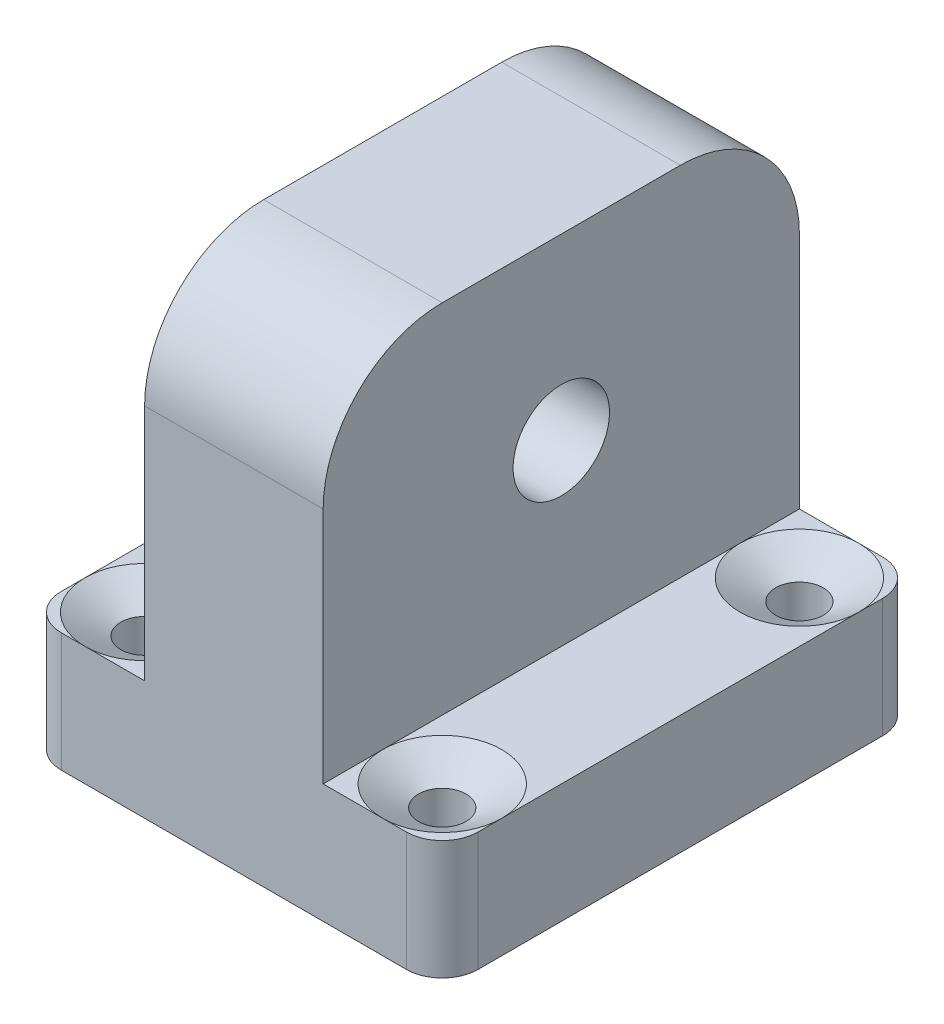
ISO-10303-21;
HEADER;
FILE_DESCRIPTION(('STEP AP214'),'2;1');
FILE_NAME('part.step','',(''),(''),'','','');
FILE_SCHEMA(('AUTOMOTIVE_DESIGN { 1 0 10303 214 1 1 1 1 }'));
ENDSEC;
DATA;
#1=APPLICATION_CONTEXT('core data for automotive mechanical design processes');
#2=APPLICATION_PROTOCOL_DEFINITION('international standard','automotive_design',2000,#1);
#3=PRODUCT_CONTEXT('',#1,'mechanical');
#4=PRODUCT('Part','Part','',(#3));
#5=PRODUCT_RELATED_PRODUCT_CATEGORY('part','',(#4));
#6=PRODUCT_DEFINITION_FORMATION('','',#4);
#7=PRODUCT_DEFINITION_CONTEXT('part definition',#1,'design');
#8=PRODUCT_DEFINITION('design','',#6,#7);
#9=PRODUCT_DEFINITION_SHAPE('','',#8);
#10=(LENGTH_UNIT() NAMED_UNIT(*) SI_UNIT(.MILLI.,.METRE.));
#11=(NAMED_UNIT(*) PLANE_ANGLE_UNIT() SI_UNIT($,.RADIAN.));
#12=(NAMED_UNIT(*) SI_UNIT($,.STERADIAN.) SOLID_ANGLE_UNIT());
#13=UNCERTAINTY_MEASURE_WITH_UNIT(LENGTH_MEASURE(1.E-05),#10,'distance_accuracy_value','');
#14=(GEOMETRIC_REPRESENTATION_CONTEXT(3) GLOBAL_UNCERTAINTY_ASSIGNED_CONTEXT((#13)) GLOBAL_UNIT_ASSIGNED_CONTEXT((#10,
#11,#12)) REPRESENTATION_CONTEXT('',''));
#15=CARTESIAN_POINT('',(0.,0.,0.));
#16=DIRECTION('',(0.,0.,1.));
#17=DIRECTION('',(1.,0.,0.));
#18=AXIS2_PLACEMENT_3D('',#15,#16,#17);
#19=CARTESIAN_POINT('',(-17.500025,25.,0.));
#20=DIRECTION('',(1.,0.,0.));
#21=DIRECTION('',(0.,0.,-1.));
#22=AXIS2_PLACEMENT_3D('',#19,#20,#21);
#23=CYLINDRICAL_SURFACE('',#22,7.);
#24=CARTESIAN_POINT('',(-7.5,25.,0.));
#25=DIRECTION('',(1.,0.,0.));
#26=DIRECTION('',(0.,0.,-1.));
#27=AXIS2_PLACEMENT_3D('',#24,#25,#26);
#28=CIRCLE('',#27,7.);
#29=CARTESIAN_POINT('',(-7.5,25.,-7.));
#30=VERTEX_POINT('',#29);
#31=EDGE_CURVE('E269',#30,#30,#28,.T.);
#32=ORIENTED_EDGE('',*,*,#31,.F.);
#33=EDGE_LOOP('',(#32));
#34=FACE_BOUND('',#33,.T.);
#35=CARTESIAN_POINT('',(-2.5,25.,0.));
#36=DIRECTION('',(1.,0.,0.));
#37=DIRECTION('',(0.,0.,-1.));
#38=AXIS2_PLACEMENT_3D('',#35,#36,#37);
#39=CIRCLE('',#38,7.);
#40=CARTESIAN_POINT('',(-2.5,25.,-7.));
#41=VERTEX_POINT('',#40);
#42=EDGE_CURVE('E11',#41,#41,#39,.F.);
#43=ORIENTED_EDGE('',*,*,#42,.F.);
#44=EDGE_LOOP('',(#43));
#45=FACE_BOUND('',#44,.T.);
#46=ADVANCED_FACE('F45',(#34,#45),#23,.F.);
#47=CARTESIAN_POINT('',(0.,10.,0.));
#48=DIRECTION('',(0.,1.,0.));
#49=DIRECTION('',(0.,0.,1.));
#50=AXIS2_PLACEMENT_3D('',#47,#48,#49);
#51=PLANE('',#50);
#52=DIRECTION('',(0.,0.,1.));
#53=VECTOR('',#52,1.);
#54=CARTESIAN_POINT('',(-17.5,10.,-20.));
#55=LINE('',#54,#53);
#56=CARTESIAN_POINT('',(-17.5,10.,-17.));
#57=VERTEX_POINT('',#56);
#58=CARTESIAN_POINT('',(-17.5,10.,-15.));
#59=VERTEX_POINT('',#58);
#60=EDGE_CURVE('E256',#57,#59,#55,.T.);
#61=ORIENTED_EDGE('',*,*,#60,.T.);
#62=CARTESIAN_POINT('',(-12.5,10.,-15.));
#63=DIRECTION('',(0.,1.,0.));
#64=DIRECTION('',(0.,0.,1.));
#65=AXIS2_PLACEMENT_3D('',#62,#63,#64);
#66=CIRCLE('',#65,5.00000000000002);
#67=CARTESIAN_POINT('',(-12.5,10.,-20.));
#68=VERTEX_POINT('',#67);
#69=EDGE_CURVE('E789',#59,#68,#66,.F.);
#70=ORIENTED_EDGE('',*,*,#69,.T.);
#71=DIRECTION('',(-1.,0.,0.));
#72=VECTOR('',#71,1.);
#73=CARTESIAN_POINT('',(-17.5,10.,-20.));
#74=LINE('',#73,#72);
#75=CARTESIAN_POINT('',(-14.5,10.,-20.));
#76=VERTEX_POINT('',#75);
#77=EDGE_CURVE('E333',#68,#76,#74,.T.);
#78=ORIENTED_EDGE('',*,*,#77,.T.);
#79=CARTESIAN_POINT('',(-14.5,10.,-17.));
#80=DIRECTION('',(0.,1.,0.));
#81=DIRECTION('',(0.,0.,1.));
#82=AXIS2_PLACEMENT_3D('',#79,#80,#81);
#83=CIRCLE('',#82,3.);
#84=EDGE_CURVE('E426',#76,#57,#83,.T.);
#85=ORIENTED_EDGE('',*,*,#84,.T.);
#86=EDGE_LOOP('',(#61,#70,#78,#85));
#87=FACE_BOUND('',#86,.T.);
#88=ADVANCED_FACE('F497',(#87),#51,.T.);
#89=CARTESIAN_POINT('',(-7.5,10.,-20.));
#90=VERTEX_POINT('',#89);
#91=EDGE_CURVE('E247',#90,#68,#74,.T.);
#92=ORIENTED_EDGE('',*,*,#91,.T.);
#93=CARTESIAN_POINT('',(-12.5,10.,-15.));
#94=DIRECTION('',(0.,1.,0.));
#95=DIRECTION('',(0.,0.,1.));
#96=AXIS2_PLACEMENT_3D('',#93,#94,#95);
#97=CIRCLE('',#96,5.00000000000002);
#98=CARTESIAN_POINT('',(-7.5,10.,-15.));
#99=VERTEX_POINT('',#98);
#100=EDGE_CURVE('E68',#68,#99,#97,.F.);
#101=ORIENTED_EDGE('',*,*,#100,.T.);
#102=DIRECTION('',(0.,0.,1.));
#103=VECTOR('',#102,1.);
#104=CARTESIAN_POINT('',(-7.5,10.,-20.));
#105=LINE('',#104,#103);
#106=EDGE_CURVE('E224',#90,#99,#105,.T.);
#107=ORIENTED_EDGE('',*,*,#106,.F.);
#108=EDGE_LOOP('',(#92,#101,#107));
#109=FACE_BOUND('',#108,.T.);
#110=ADVANCED_FACE('F505',(#109),#51,.T.);
#111=DIRECTION('',(1.,0.,0.));
#112=VECTOR('',#111,1.);
#113=CARTESIAN_POINT('',(-17.5,10.,20.));
#114=LINE('',#113,#112);
#115=CARTESIAN_POINT('',(-14.5,10.,20.));
#116=VERTEX_POINT('',#115);
#117=CARTESIAN_POINT('',(-12.5,10.,20.));
#118=VERTEX_POINT('',#117);
#119=EDGE_CURVE('E202',#116,#118,#114,.T.);
#120=ORIENTED_EDGE('',*,*,#119,.T.);
#121=CARTESIAN_POINT('',(-12.5,10.,15.));
#122=DIRECTION('',(0.,1.,0.));
#123=DIRECTION('',(0.,0.,1.));
#124=AXIS2_PLACEMENT_3D('',#121,#122,#123);
#125=CIRCLE('',#124,5.00000000000002);
#126=CARTESIAN_POINT('',(-17.5,10.,15.));
#127=VERTEX_POINT('',#126);
#128=EDGE_CURVE('E796',#118,#127,#125,.F.);
#129=ORIENTED_EDGE('',*,*,#128,.T.);
#130=CARTESIAN_POINT('',(-17.5,10.,17.));
#131=VERTEX_POINT('',#130);
#132=EDGE_CURVE('E268',#127,#131,#55,.T.);
#133=ORIENTED_EDGE('',*,*,#132,.T.);
#134=CARTESIAN_POINT('',(-14.5,10.,17.));
#135=DIRECTION('',(0.,1.,0.));
#136=DIRECTION('',(0.,0.,1.));
#137=AXIS2_PLACEMENT_3D('',#134,#135,#136);
#138=CIRCLE('',#137,3.);
#139=EDGE_CURVE('E301',#131,#116,#138,.T.);
#140=ORIENTED_EDGE('',*,*,#139,.T.);
#141=EDGE_LOOP('',(#120,#129,#133,#140));
#142=FACE_BOUND('',#141,.T.);
#143=ADVANCED_FACE('F433',(#142),#51,.T.);
#144=CARTESIAN_POINT('',(-7.5,10.,15.));
#145=VERTEX_POINT('',#144);
#146=EDGE_CURVE('E190',#99,#145,#105,.T.);
#147=ORIENTED_EDGE('',*,*,#146,.F.);
#148=CARTESIAN_POINT('',(-12.5,10.,-15.));
#149=DIRECTION('',(0.,1.,0.));
#150=DIRECTION('',(0.,0.,1.));
#151=AXIS2_PLACEMENT_3D('',#148,#149,#150);
#152=CIRCLE('',#151,5.00000000000002);
#153=EDGE_CURVE('E794',#99,#59,#152,.F.);
#154=ORIENTED_EDGE('',*,*,#153,.T.);
#155=EDGE_CURVE('E798',#59,#127,#55,.T.);
#156=ORIENTED_EDGE('',*,*,#155,.T.);
#157=CARTESIAN_POINT('',(-12.5,10.,15.));
#158=DIRECTION('',(0.,1.,0.));
#159=DIRECTION('',(0.,0.,1.));
#160=AXIS2_PLACEMENT_3D('',#157,#158,#159);
#161=CIRCLE('',#160,5.00000000000002);
#162=EDGE_CURVE('E60',#127,#145,#161,.F.);
#163=ORIENTED_EDGE('',*,*,#162,.T.);
#164=EDGE_LOOP('',(#147,#154,#156,#163));
#165=FACE_BOUND('',#164,.T.);
#166=ADVANCED_FACE('F605',(#165),#51,.T.);
#167=DIRECTION('',(0.,0.,-1.));
#168=VECTOR('',#167,1.);
#169=CARTESIAN_POINT('',(7.5,10.,-20.));
#170=LINE('',#169,#168);
#171=CARTESIAN_POINT('',(7.5,10.,-15.));
#172=VERTEX_POINT('',#171);
#173=CARTESIAN_POINT('',(7.5,10.,-20.));
#174=VERTEX_POINT('',#173);
#175=EDGE_CURVE('E314',#172,#174,#170,.T.);
#176=ORIENTED_EDGE('',*,*,#175,.F.);
#177=CARTESIAN_POINT('',(12.5,10.,-15.));
#178=DIRECTION('',(0.,1.,0.));
#179=DIRECTION('',(0.,0.,1.));
#180=AXIS2_PLACEMENT_3D('',#177,#178,#179);
#181=CIRCLE('',#180,5.00000000000002);
#182=CARTESIAN_POINT('',(12.5,10.,-20.));
#183=VERTEX_POINT('',#182);
#184=EDGE_CURVE('E325',#172,#183,#181,.F.);
#185=ORIENTED_EDGE('',*,*,#184,.T.);
#186=EDGE_CURVE('E242',#183,#174,#74,.T.);
#187=ORIENTED_EDGE('',*,*,#186,.T.);
#188=EDGE_LOOP('',(#176,#185,#187));
#189=FACE_BOUND('',#188,.T.);
#190=ADVANCED_FACE('F465',(#189),#51,.T.);
#191=CARTESIAN_POINT('',(14.5,10.,-20.));
#192=VERTEX_POINT('',#191);
#193=EDGE_CURVE('E246',#192,#183,#74,.T.);
#194=ORIENTED_EDGE('',*,*,#193,.T.);
#195=CARTESIAN_POINT('',(12.5,10.,-15.));
#196=DIRECTION('',(0.,1.,0.));
#197=DIRECTION('',(0.,0.,1.));
#198=AXIS2_PLACEMENT_3D('',#195,#196,#197);
#199=CIRCLE('',#198,5.00000000000002);
#200=CARTESIAN_POINT('',(17.5,10.,-15.));
#201=VERTEX_POINT('',#200);
#202=EDGE_CURVE('E323',#183,#201,#199,.F.);
#203=ORIENTED_EDGE('',*,*,#202,.T.);
#204=DIRECTION('',(0.,0.,-1.));
#205=VECTOR('',#204,1.);
#206=CARTESIAN_POINT('',(17.5,10.,-20.));
#207=LINE('',#206,#205);
#208=CARTESIAN_POINT('',(17.5,10.,-17.));
#209=VERTEX_POINT('',#208);
#210=EDGE_CURVE('E368',#201,#209,#207,.T.);
#211=ORIENTED_EDGE('',*,*,#210,.T.);
#212=CARTESIAN_POINT('',(14.5,10.,-17.));
#213=DIRECTION('',(0.,1.,0.));
#214=DIRECTION('',(0.,0.,1.));
#215=AXIS2_PLACEMENT_3D('',#212,#213,#214);
#216=CIRCLE('',#215,3.);
#217=EDGE_CURVE('E293',#209,#192,#216,.T.);
#218=ORIENTED_EDGE('',*,*,#217,.T.);
#219=EDGE_LOOP('',(#194,#203,#211,#218));
#220=FACE_BOUND('',#219,.T.);
#221=ADVANCED_FACE('F459',(#220),#51,.T.);
#222=CARTESIAN_POINT('',(7.5,10.,20.));
#223=VERTEX_POINT('',#222);
#224=CARTESIAN_POINT('',(12.5,10.,20.));
#225=VERTEX_POINT('',#224);
#226=EDGE_CURVE('E203',#223,#225,#114,.T.);
#227=ORIENTED_EDGE('',*,*,#226,.T.);
#228=CARTESIAN_POINT('',(12.5,10.,15.));
#229=DIRECTION('',(0.,1.,0.));
#230=DIRECTION('',(0.,0.,1.));
#231=AXIS2_PLACEMENT_3D('',#228,#229,#230);
#232=CIRCLE('',#231,5.00000000000001);
#233=CARTESIAN_POINT('',(7.5,10.,15.));
#234=VERTEX_POINT('',#233);
#235=EDGE_CURVE('E318',#225,#234,#232,.F.);
#236=ORIENTED_EDGE('',*,*,#235,.T.);
#237=EDGE_CURVE('E193',#223,#234,#170,.T.);
#238=ORIENTED_EDGE('',*,*,#237,.F.);
#239=EDGE_LOOP('',(#227,#236,#238));
#240=FACE_BOUND('',#239,.T.);
#241=ADVANCED_FACE('F394',(#240),#51,.T.);
#242=CARTESIAN_POINT('',(17.5,10.,15.));
#243=VERTEX_POINT('',#242);
#244=EDGE_CURVE('E373',#243,#201,#207,.T.);
#245=ORIENTED_EDGE('',*,*,#244,.T.);
#246=CARTESIAN_POINT('',(12.5,10.,-15.));
#247=DIRECTION('',(0.,1.,0.));
#248=DIRECTION('',(0.,0.,1.));
#249=AXIS2_PLACEMENT_3D('',#246,#247,#248);
#250=CIRCLE('',#249,5.00000000000002);
#251=EDGE_CURVE('E321',#201,#172,#250,.F.);
#252=ORIENTED_EDGE('',*,*,#251,.T.);
#253=EDGE_CURVE('E248',#234,#172,#170,.T.);
#254=ORIENTED_EDGE('',*,*,#253,.F.);
#255=CARTESIAN_POINT('',(12.5,10.,15.));
#256=DIRECTION('',(0.,1.,0.));
#257=DIRECTION('',(0.,0.,1.));
#258=AXIS2_PLACEMENT_3D('',#255,#256,#257);
#259=CIRCLE('',#258,5.00000000000001);
#260=EDGE_CURVE('E316',#234,#243,#259,.F.);
#261=ORIENTED_EDGE('',*,*,#260,.T.);
#262=EDGE_LOOP('',(#245,#252,#254,#261));
#263=FACE_BOUND('',#262,.T.);
#264=ADVANCED_FACE('F399',(#263),#51,.T.);
#265=CARTESIAN_POINT('',(17.5,10.,17.));
#266=VERTEX_POINT('',#265);
#267=EDGE_CURVE('E254',#266,#243,#207,.T.);
#268=ORIENTED_EDGE('',*,*,#267,.T.);
#269=CARTESIAN_POINT('',(12.5,10.,15.));
#270=DIRECTION('',(0.,1.,0.));
#271=DIRECTION('',(0.,0.,1.));
#272=AXIS2_PLACEMENT_3D('',#269,#270,#271);
#273=CIRCLE('',#272,5.00000000000001);
#274=EDGE_CURVE('E241',#243,#225,#273,.F.);
#275=ORIENTED_EDGE('',*,*,#274,.T.);
#276=CARTESIAN_POINT('',(14.5,10.,20.));
#277=VERTEX_POINT('',#276);
#278=EDGE_CURVE('E312',#225,#277,#114,.T.);
#279=ORIENTED_EDGE('',*,*,#278,.T.);
#280=CARTESIAN_POINT('',(14.5,10.,17.));
#281=DIRECTION('',(0.,1.,0.));
#282=DIRECTION('',(0.,0.,1.));
#283=AXIS2_PLACEMENT_3D('',#280,#281,#282);
#284=CIRCLE('',#283,3.);
#285=EDGE_CURVE('E291',#277,#266,#284,.T.);
#286=ORIENTED_EDGE('',*,*,#285,.T.);
#287=EDGE_LOOP('',(#268,#275,#279,#286));
#288=FACE_BOUND('',#287,.T.);
#289=ADVANCED_FACE('F381',(#288),#51,.T.);
#290=CARTESIAN_POINT('',(17.5,10.,-20.));
#291=DIRECTION('',(-1.,0.,0.));
#292=DIRECTION('',(0.,0.,1.));
#293=AXIS2_PLACEMENT_3D('',#290,#291,#292);
#294=PLANE('',#293);
#295=DIRECTION('',(0.,0.,-1.));
#296=VECTOR('',#295,1.);
#297=CARTESIAN_POINT('',(17.5,0.,-20.));
#298=LINE('',#297,#296);
#299=CARTESIAN_POINT('',(17.5,0.,17.));
#300=VERTEX_POINT('',#299);
#301=CARTESIAN_POINT('',(17.5,0.,-17.));
#302=VERTEX_POINT('',#301);
#303=EDGE_CURVE('E306',#300,#302,#298,.T.);
#304=ORIENTED_EDGE('',*,*,#303,.T.);
#305=DIRECTION('',(0.,-1.,0.));
#306=VECTOR('',#305,1.);
#307=CARTESIAN_POINT('',(17.5,10.,-17.));
#308=LINE('',#307,#306);
#309=EDGE_CURVE('E288',#302,#209,#308,.F.);
#310=ORIENTED_EDGE('',*,*,#309,.T.);
#311=ORIENTED_EDGE('',*,*,#210,.F.);
#312=ORIENTED_EDGE('',*,*,#244,.F.);
#313=ORIENTED_EDGE('',*,*,#267,.F.);
#314=DIRECTION('',(0.,-1.,0.));
#315=VECTOR('',#314,1.);
#316=CARTESIAN_POINT('',(17.5,10.,17.));
#317=LINE('',#316,#315);
#318=EDGE_CURVE('E285',#266,#300,#317,.T.);
#319=ORIENTED_EDGE('',*,*,#318,.T.);
#320=EDGE_LOOP('',(#304,#310,#311,#312,#313,#319));
#321=FACE_BOUND('',#320,.T.);
#322=ADVANCED_FACE('F461',(#321),#294,.F.);
#323=CARTESIAN_POINT('',(-17.5,10.,-20.));
#324=DIRECTION('',(0.,0.,1.));
#325=DIRECTION('',(1.,0.,0.));
#326=AXIS2_PLACEMENT_3D('',#323,#324,#325);
#327=PLANE('',#326);
#328=DIRECTION('',(0.,-1.,0.));
#329=VECTOR('',#328,1.);
#330=CARTESIAN_POINT('',(-7.5,40.,-20.));
#331=LINE('',#330,#329);
#332=CARTESIAN_POINT('',(-7.5,30.,-20.));
#333=VERTEX_POINT('',#332);
#334=EDGE_CURVE('E209',#333,#90,#331,.T.);
#335=ORIENTED_EDGE('',*,*,#334,.F.);
#336=DIRECTION('',(-1.,0.,0.));
#337=VECTOR('',#336,1.);
#338=CARTESIAN_POINT('',(7.5,30.,-20.));
#339=LINE('',#338,#337);
#340=CARTESIAN_POINT('',(7.5,30.,-20.));
#341=VERTEX_POINT('',#340);
#342=EDGE_CURVE('E236',#333,#341,#339,.F.);
#343=ORIENTED_EDGE('',*,*,#342,.T.);
#344=DIRECTION('',(0.,-1.,0.));
#345=VECTOR('',#344,1.);
#346=CARTESIAN_POINT('',(7.5,40.,-20.));
#347=LINE('',#346,#345);
#348=EDGE_CURVE('E212',#341,#174,#347,.T.);
#349=ORIENTED_EDGE('',*,*,#348,.T.);
#350=ORIENTED_EDGE('',*,*,#186,.F.);
#351=ORIENTED_EDGE('',*,*,#193,.F.);
#352=DIRECTION('',(0.,-1.,0.));
#353=VECTOR('',#352,1.);
#354=CARTESIAN_POINT('',(14.5,10.,-20.));
#355=LINE('',#354,#353);
#356=CARTESIAN_POINT('',(14.5,0.,-20.));
#357=VERTEX_POINT('',#356);
#358=EDGE_CURVE('E274',#192,#357,#355,.T.);
#359=ORIENTED_EDGE('',*,*,#358,.T.);
#360=DIRECTION('',(-1.,0.,0.));
#361=VECTOR('',#360,1.);
#362=CARTESIAN_POINT('',(-17.5,0.,-20.));
#363=LINE('',#362,#361);
#364=CARTESIAN_POINT('',(-14.5,0.,-20.));
#365=VERTEX_POINT('',#364);
#366=EDGE_CURVE('E355',#357,#365,#363,.T.);
#367=ORIENTED_EDGE('',*,*,#366,.T.);
#368=DIRECTION('',(0.,-1.,0.));
#369=VECTOR('',#368,1.);
#370=CARTESIAN_POINT('',(-14.5,10.,-20.));
#371=LINE('',#370,#369);
#372=EDGE_CURVE('E271',#365,#76,#371,.F.);
#373=ORIENTED_EDGE('',*,*,#372,.T.);
#374=ORIENTED_EDGE('',*,*,#77,.F.);
#375=ORIENTED_EDGE('',*,*,#91,.F.);
#376=EDGE_LOOP('',(#335,#343,#349,#350,#351,#359,#367,#373,#374,#375));
#377=FACE_BOUND('',#376,.T.);
#378=ADVANCED_FACE('F456',(#377),#327,.F.);
#379=CARTESIAN_POINT('',(-17.5,10.,-20.));
#380=DIRECTION('',(1.,0.,0.));
#381=DIRECTION('',(0.,0.,-1.));
#382=AXIS2_PLACEMENT_3D('',#379,#380,#381);
#383=PLANE('',#382);
#384=ORIENTED_EDGE('',*,*,#60,.F.);
#385=DIRECTION('',(0.,-1.,0.));
#386=VECTOR('',#385,1.);
#387=CARTESIAN_POINT('',(-17.5,10.,-17.));
#388=LINE('',#387,#386);
#389=CARTESIAN_POINT('',(-17.5,0.,-17.));
#390=VERTEX_POINT('',#389);
#391=EDGE_CURVE('E298',#57,#390,#388,.T.);
#392=ORIENTED_EDGE('',*,*,#391,.T.);
#393=DIRECTION('',(0.,0.,1.));
#394=VECTOR('',#393,1.);
#395=CARTESIAN_POINT('',(-17.5,0.,-20.));
#396=LINE('',#395,#394);
#397=CARTESIAN_POINT('',(-17.5,0.,17.));
#398=VERTEX_POINT('',#397);
#399=EDGE_CURVE('E360',#390,#398,#396,.T.);
#400=ORIENTED_EDGE('',*,*,#399,.T.);
#401=DIRECTION('',(0.,-1.,0.));
#402=VECTOR('',#401,1.);
#403=CARTESIAN_POINT('',(-17.5,10.,17.));
#404=LINE('',#403,#402);
#405=EDGE_CURVE('E295',#398,#131,#404,.F.);
#406=ORIENTED_EDGE('',*,*,#405,.T.);
#407=ORIENTED_EDGE('',*,*,#132,.F.);
#408=ORIENTED_EDGE('',*,*,#155,.F.);
#409=EDGE_LOOP('',(#384,#392,#400,#406,#407,#408));
#410=FACE_BOUND('',#409,.T.);
#411=ADVANCED_FACE('F445',(#410),#383,.F.);
#412=CARTESIAN_POINT('',(-17.5,10.,20.));
#413=DIRECTION('',(0.,0.,-1.));
#414=DIRECTION('',(-1.,0.,0.));
#415=AXIS2_PLACEMENT_3D('',#412,#413,#414);
#416=PLANE('',#415);
#417=DIRECTION('',(0.,-1.,0.));
#418=VECTOR('',#417,1.);
#419=CARTESIAN_POINT('',(7.5,40.,20.));
#420=LINE('',#419,#418);
#421=CARTESIAN_POINT('',(7.5,30.,20.));
#422=VERTEX_POINT('',#421);
#423=EDGE_CURVE('E210',#422,#223,#420,.T.);
#424=ORIENTED_EDGE('',*,*,#423,.F.);
#425=DIRECTION('',(1.,0.,0.));
#426=VECTOR('',#425,1.);
#427=CARTESIAN_POINT('',(-7.5,30.,20.));
#428=LINE('',#427,#426);
#429=CARTESIAN_POINT('',(-7.5,30.,20.));
#430=VERTEX_POINT('',#429);
#431=EDGE_CURVE('E208',#422,#430,#428,.F.);
#432=ORIENTED_EDGE('',*,*,#431,.T.);
#433=DIRECTION('',(0.,-1.,0.));
#434=VECTOR('',#433,1.);
#435=CARTESIAN_POINT('',(-7.5,40.,20.));
#436=LINE('',#435,#434);
#437=CARTESIAN_POINT('',(-7.5,10.,20.));
#438=VERTEX_POINT('',#437);
#439=EDGE_CURVE('E187',#430,#438,#436,.T.);
#440=ORIENTED_EDGE('',*,*,#439,.T.);
#441=EDGE_CURVE('E196',#118,#438,#114,.T.);
#442=ORIENTED_EDGE('',*,*,#441,.F.);
#443=ORIENTED_EDGE('',*,*,#119,.F.);
#444=DIRECTION('',(0.,-1.,0.));
#445=VECTOR('',#444,1.);
#446=CARTESIAN_POINT('',(-14.5,10.,20.));
#447=LINE('',#446,#445);
#448=CARTESIAN_POINT('',(-14.5,0.,20.));
#449=VERTEX_POINT('',#448);
#450=EDGE_CURVE('E421',#116,#449,#447,.T.);
#451=ORIENTED_EDGE('',*,*,#450,.T.);
#452=DIRECTION('',(1.,0.,0.));
#453=VECTOR('',#452,1.);
#454=CARTESIAN_POINT('',(-17.5,0.,20.));
#455=LINE('',#454,#453);
#456=CARTESIAN_POINT('',(14.5,0.,20.));
#457=VERTEX_POINT('',#456);
#458=EDGE_CURVE('E365',#449,#457,#455,.T.);
#459=ORIENTED_EDGE('',*,*,#458,.T.);
#460=DIRECTION('',(0.,-1.,0.));
#461=VECTOR('',#460,1.);
#462=CARTESIAN_POINT('',(14.5,10.,20.));
#463=LINE('',#462,#461);
#464=EDGE_CURVE('E425',#457,#277,#463,.F.);
#465=ORIENTED_EDGE('',*,*,#464,.T.);
#466=ORIENTED_EDGE('',*,*,#278,.F.);
#467=ORIENTED_EDGE('',*,*,#226,.F.);
#468=EDGE_LOOP('',(#424,#432,#440,#442,#443,#451,#459,#465,#466,#467));
#469=FACE_BOUND('',#468,.T.);
#470=ADVANCED_FACE('F206',(#469),#416,.F.);
#471=EDGE_CURVE('E183',#145,#438,#105,.T.);
#472=ORIENTED_EDGE('',*,*,#471,.F.);
#473=CARTESIAN_POINT('',(-12.5,10.,15.));
#474=DIRECTION('',(0.,1.,0.));
#475=DIRECTION('',(0.,0.,1.));
#476=AXIS2_PLACEMENT_3D('',#473,#474,#475);
#477=CIRCLE('',#476,5.00000000000002);
#478=EDGE_CURVE('E198',#145,#118,#477,.F.);
#479=ORIENTED_EDGE('',*,*,#478,.T.);
#480=ORIENTED_EDGE('',*,*,#441,.T.);
#481=EDGE_LOOP('',(#472,#479,#480));
#482=FACE_BOUND('',#481,.T.);
#483=ADVANCED_FACE('F197',(#482),#51,.T.);
#484=CARTESIAN_POINT('',(0.,0.,0.));
#485=DIRECTION('',(0.,1.,0.));
#486=DIRECTION('',(0.,0.,1.));
#487=AXIS2_PLACEMENT_3D('',#484,#485,#486);
#488=PLANE('',#487);
#489=CARTESIAN_POINT('',(12.5,0.,-15.));
#490=DIRECTION('',(0.,1.,0.));
#491=DIRECTION('',(0.,0.,1.));
#492=AXIS2_PLACEMENT_3D('',#489,#490,#491);
#493=CIRCLE('',#492,2.);
#494=CARTESIAN_POINT('',(12.5,0.,-13.));
#495=VERTEX_POINT('',#494);
#496=EDGE_CURVE('E340',#495,#495,#493,.T.);
#497=ORIENTED_EDGE('',*,*,#496,.T.);
#498=EDGE_LOOP('',(#497));
#499=FACE_BOUND('',#498,.T.);
#500=CARTESIAN_POINT('',(12.5,0.,15.));
#501=DIRECTION('',(0.,1.,0.));
#502=DIRECTION('',(0.,0.,1.));
#503=AXIS2_PLACEMENT_3D('',#500,#501,#502);
#504=CIRCLE('',#503,2.);
#505=CARTESIAN_POINT('',(12.5,0.,17.));
#506=VERTEX_POINT('',#505);
#507=EDGE_CURVE('E345',#506,#506,#504,.T.);
#508=ORIENTED_EDGE('',*,*,#507,.T.);
#509=EDGE_LOOP('',(#508));
#510=FACE_BOUND('',#509,.T.);
#511=CARTESIAN_POINT('',(-12.5,0.,15.));
#512=DIRECTION('',(0.,1.,0.));
#513=DIRECTION('',(0.,0.,1.));
#514=AXIS2_PLACEMENT_3D('',#511,#512,#513);
#515=CIRCLE('',#514,2.);
#516=CARTESIAN_POINT('',(-12.5,0.,17.));
#517=VERTEX_POINT('',#516);
#518=EDGE_CURVE('E348',#517,#517,#515,.T.);
#519=ORIENTED_EDGE('',*,*,#518,.T.);
#520=EDGE_LOOP('',(#519));
#521=FACE_BOUND('',#520,.T.);
#522=CARTESIAN_POINT('',(-12.5,0.,-15.));
#523=DIRECTION('',(0.,1.,0.));
#524=DIRECTION('',(0.,0.,1.));
#525=AXIS2_PLACEMENT_3D('',#522,#523,#524);
#526=CIRCLE('',#525,2.);
#527=CARTESIAN_POINT('',(-12.5,0.,-13.));
#528=VERTEX_POINT('',#527);
#529=EDGE_CURVE('E350',#528,#528,#526,.T.);
#530=ORIENTED_EDGE('',*,*,#529,.T.);
#531=EDGE_LOOP('',(#530));
#532=FACE_BOUND('',#531,.T.);
#533=ORIENTED_EDGE('',*,*,#366,.F.);
#534=CARTESIAN_POINT('',(14.5,0.,-17.));
#535=DIRECTION('',(0.,1.,0.));
#536=DIRECTION('',(0.,0.,1.));
#537=AXIS2_PLACEMENT_3D('',#534,#535,#536);
#538=CIRCLE('',#537,3.);
#539=EDGE_CURVE('E283',#357,#302,#538,.F.);
#540=ORIENTED_EDGE('',*,*,#539,.T.);
#541=ORIENTED_EDGE('',*,*,#303,.F.);
#542=CARTESIAN_POINT('',(14.5,0.,17.));
#543=DIRECTION('',(0.,1.,0.));
#544=DIRECTION('',(0.,0.,1.));
#545=AXIS2_PLACEMENT_3D('',#542,#543,#544);
#546=CIRCLE('',#545,3.);
#547=EDGE_CURVE('E277',#300,#457,#546,.F.);
#548=ORIENTED_EDGE('',*,*,#547,.T.);
#549=ORIENTED_EDGE('',*,*,#458,.F.);
#550=CARTESIAN_POINT('',(-14.5,0.,17.));
#551=DIRECTION('',(0.,1.,0.));
#552=DIRECTION('',(0.,0.,1.));
#553=AXIS2_PLACEMENT_3D('',#550,#551,#552);
#554=CIRCLE('',#553,3.);
#555=EDGE_CURVE('E279',#449,#398,#554,.F.);
#556=ORIENTED_EDGE('',*,*,#555,.T.);
#557=ORIENTED_EDGE('',*,*,#399,.F.);
#558=CARTESIAN_POINT('',(-14.5,0.,-17.));
#559=DIRECTION('',(0.,1.,0.));
#560=DIRECTION('',(0.,0.,1.));
#561=AXIS2_PLACEMENT_3D('',#558,#559,#560);
#562=CIRCLE('',#561,3.);
#563=EDGE_CURVE('E281',#390,#365,#562,.F.);
#564=ORIENTED_EDGE('',*,*,#563,.T.);
#565=EDGE_LOOP('',(#533,#540,#541,#548,#549,#556,#557,#564));
#566=FACE_BOUND('',#565,.T.);
#567=ADVANCED_FACE('F443',(#499,#510,#521,#532,#566),#488,.F.);
#568=CARTESIAN_POINT('',(-12.5,0.,-15.));
#569=DIRECTION('',(0.,1.,0.));
#570=DIRECTION('',(0.,0.,1.));
#571=AXIS2_PLACEMENT_3D('',#568,#569,#570);
#572=CYLINDRICAL_SURFACE('',#571,2.);
#573=CARTESIAN_POINT('',(-12.5,8.26794919243112,-15.));
#574=DIRECTION('',(0.,1.,0.));
#575=DIRECTION('',(0.,0.,1.));
#576=AXIS2_PLACEMENT_3D('',#573,#574,#575);
#577=CIRCLE('',#576,2.);
#578=CARTESIAN_POINT('',(-12.5,8.26794919243112,-13.));
#579=VERTEX_POINT('',#578);
#580=EDGE_CURVE('E331',#579,#579,#577,.T.);
#581=ORIENTED_EDGE('',*,*,#580,.T.);
#582=EDGE_LOOP('',(#581));
#583=FACE_BOUND('',#582,.T.);
#584=ORIENTED_EDGE('',*,*,#529,.F.);
#585=EDGE_LOOP('',(#584));
#586=FACE_BOUND('',#585,.T.);
#587=ADVANCED_FACE('F527',(#583,#586),#572,.F.);
#588=CARTESIAN_POINT('',(-12.5,0.,15.));
#589=DIRECTION('',(0.,1.,0.));
#590=DIRECTION('',(0.,0.,1.));
#591=AXIS2_PLACEMENT_3D('',#588,#589,#590);
#592=CYLINDRICAL_SURFACE('',#591,2.);
#593=CARTESIAN_POINT('',(-12.5,8.26794919243112,15.));
#594=DIRECTION('',(0.,1.,0.));
#595=DIRECTION('',(0.,0.,1.));
#596=AXIS2_PLACEMENT_3D('',#593,#594,#595);
#597=CIRCLE('',#596,2.);
#598=CARTESIAN_POINT('',(-12.5,8.26794919243112,17.));
#599=VERTEX_POINT('',#598);
#600=EDGE_CURVE('E53',#599,#599,#597,.T.);
#601=ORIENTED_EDGE('',*,*,#600,.T.);
#602=EDGE_LOOP('',(#601));
#603=FACE_BOUND('',#602,.T.);
#604=ORIENTED_EDGE('',*,*,#518,.F.);
#605=EDGE_LOOP('',(#604));
#606=FACE_BOUND('',#605,.T.);
#607=ADVANCED_FACE('F523',(#603,#606),#592,.F.);
#608=CARTESIAN_POINT('',(12.5,0.,15.));
#609=DIRECTION('',(0.,1.,0.));
#610=DIRECTION('',(0.,0.,1.));
#611=AXIS2_PLACEMENT_3D('',#608,#609,#610);
#612=CYLINDRICAL_SURFACE('',#611,2.);
#613=CARTESIAN_POINT('',(12.5,8.26794919243113,15.));
#614=DIRECTION('',(0.,1.,0.));
#615=DIRECTION('',(0.,0.,1.));
#616=AXIS2_PLACEMENT_3D('',#613,#614,#615);
#617=CIRCLE('',#616,2.);
#618=CARTESIAN_POINT('',(12.5,8.26794919243113,17.));
#619=VERTEX_POINT('',#618);
#620=EDGE_CURVE('E328',#619,#619,#617,.T.);
#621=ORIENTED_EDGE('',*,*,#620,.T.);
#622=EDGE_LOOP('',(#621));
#623=FACE_BOUND('',#622,.T.);
#624=ORIENTED_EDGE('',*,*,#507,.F.);
#625=EDGE_LOOP('',(#624));
#626=FACE_BOUND('',#625,.T.);
#627=ADVANCED_FACE('F519',(#623,#626),#612,.F.);
#628=CARTESIAN_POINT('',(12.5,0.,-15.));
#629=DIRECTION('',(0.,1.,0.));
#630=DIRECTION('',(0.,0.,1.));
#631=AXIS2_PLACEMENT_3D('',#628,#629,#630);
#632=CYLINDRICAL_SURFACE('',#631,2.);
#633=CARTESIAN_POINT('',(12.5,8.26794919243112,-15.));
#634=DIRECTION('',(0.,1.,0.));
#635=DIRECTION('',(0.,0.,1.));
#636=AXIS2_PLACEMENT_3D('',#633,#634,#635);
#637=CIRCLE('',#636,2.);
#638=CARTESIAN_POINT('',(12.5,8.26794919243112,-13.));
#639=VERTEX_POINT('',#638);
#640=EDGE_CURVE('E238',#639,#639,#637,.T.);
#641=ORIENTED_EDGE('',*,*,#640,.T.);
#642=EDGE_LOOP('',(#641));
#643=FACE_BOUND('',#642,.T.);
#644=ORIENTED_EDGE('',*,*,#496,.F.);
#645=EDGE_LOOP('',(#644));
#646=FACE_BOUND('',#645,.T.);
#647=ADVANCED_FACE('F516',(#643,#646),#632,.F.);
#648=CARTESIAN_POINT('',(7.5,40.,-20.));
#649=DIRECTION('',(-1.,0.,0.));
#650=DIRECTION('',(0.,0.,1.));
#651=AXIS2_PLACEMENT_3D('',#648,#649,#650);
#652=PLANE('',#651);
#653=DIRECTION('',(0.,0.,-1.));
#654=VECTOR('',#653,1.);
#655=CARTESIAN_POINT('',(7.5,40.,-20.));
#656=LINE('',#655,#654);
#657=CARTESIAN_POINT('',(7.5,40.,10.));
#658=VERTEX_POINT('',#657);
#659=CARTESIAN_POINT('',(7.5,40.,-10.));
#660=VERTEX_POINT('',#659);
#661=EDGE_CURVE('E478',#658,#660,#656,.T.);
#662=ORIENTED_EDGE('',*,*,#661,.F.);
#663=CARTESIAN_POINT('',(7.5,30.,10.));
#664=DIRECTION('',(-1.,0.,0.));
#665=DIRECTION('',(0.,0.,1.));
#666=AXIS2_PLACEMENT_3D('',#663,#664,#665);
#667=CIRCLE('',#666,10.);
#668=EDGE_CURVE('E219',#658,#422,#667,.F.);
#669=ORIENTED_EDGE('',*,*,#668,.T.);
#670=ORIENTED_EDGE('',*,*,#423,.T.);
#671=ORIENTED_EDGE('',*,*,#237,.T.);
#672=ORIENTED_EDGE('',*,*,#253,.T.);
#673=ORIENTED_EDGE('',*,*,#175,.T.);
#674=ORIENTED_EDGE('',*,*,#348,.F.);
#675=CARTESIAN_POINT('',(7.5,30.,-9.99999999999999));
#676=DIRECTION('',(-1.,0.,0.));
#677=DIRECTION('',(0.,0.,1.));
#678=AXIS2_PLACEMENT_3D('',#675,#676,#677);
#679=CIRCLE('',#678,10.);
#680=EDGE_CURVE('E410',#341,#660,#679,.F.);
#681=ORIENTED_EDGE('',*,*,#680,.T.);
#682=EDGE_LOOP('',(#662,#669,#670,#671,#672,#673,#674,#681));
#683=FACE_BOUND('',#682,.T.);
#684=CARTESIAN_POINT('',(7.5,25.,0.));
#685=DIRECTION('',(1.,0.,0.));
#686=DIRECTION('',(0.,0.,-1.));
#687=AXIS2_PLACEMENT_3D('',#684,#685,#686);
#688=CIRCLE('',#687,4.05);
#689=CARTESIAN_POINT('',(7.5,25.,-4.05));
#690=VERTEX_POINT('',#689);
#691=EDGE_CURVE('E471',#690,#690,#688,.T.);
#692=ORIENTED_EDGE('',*,*,#691,.F.);
#693=EDGE_LOOP('',(#692));
#694=FACE_BOUND('',#693,.T.);
#695=ADVANCED_FACE('F405',(#683,#694),#652,.F.);
#696=CARTESIAN_POINT('',(-7.5,40.,-20.));
#697=DIRECTION('',(1.,0.,0.));
#698=DIRECTION('',(0.,0.,-1.));
#699=AXIS2_PLACEMENT_3D('',#696,#697,#698);
#700=PLANE('',#699);
#701=ORIENTED_EDGE('',*,*,#31,.T.);
#702=EDGE_LOOP('',(#701));
#703=FACE_BOUND('',#702,.T.);
#704=ORIENTED_EDGE('',*,*,#439,.F.);
#705=CARTESIAN_POINT('',(-7.5,30.,10.));
#706=DIRECTION('',(1.,0.,0.));
#707=DIRECTION('',(0.,0.,-1.));
#708=AXIS2_PLACEMENT_3D('',#705,#706,#707);
#709=CIRCLE('',#708,10.);
#710=CARTESIAN_POINT('',(-7.5,40.,10.));
#711=VERTEX_POINT('',#710);
#712=EDGE_CURVE('E234',#430,#711,#709,.F.);
#713=ORIENTED_EDGE('',*,*,#712,.T.);
#714=DIRECTION('',(0.,0.,1.));
#715=VECTOR('',#714,1.);
#716=CARTESIAN_POINT('',(-7.5,40.,-20.));
#717=LINE('',#716,#715);
#718=CARTESIAN_POINT('',(-7.5,40.,-10.));
#719=VERTEX_POINT('',#718);
#720=EDGE_CURVE('E214',#719,#711,#717,.T.);
#721=ORIENTED_EDGE('',*,*,#720,.F.);
#722=CARTESIAN_POINT('',(-7.5,30.,-9.99999999999999));
#723=DIRECTION('',(1.,0.,0.));
#724=DIRECTION('',(0.,0.,-1.));
#725=AXIS2_PLACEMENT_3D('',#722,#723,#724);
#726=CIRCLE('',#725,10.);
#727=EDGE_CURVE('E232',#719,#333,#726,.F.);
#728=ORIENTED_EDGE('',*,*,#727,.T.);
#729=ORIENTED_EDGE('',*,*,#334,.T.);
#730=ORIENTED_EDGE('',*,*,#106,.T.);
#731=ORIENTED_EDGE('',*,*,#146,.T.);
#732=ORIENTED_EDGE('',*,*,#471,.T.);
#733=EDGE_LOOP('',(#704,#713,#721,#728,#729,#730,#731,#732));
#734=FACE_BOUND('',#733,.T.);
#735=ADVANCED_FACE('F185',(#703,#734),#700,.F.);
#736=CARTESIAN_POINT('',(0.,40.,0.));
#737=DIRECTION('',(0.,1.,0.));
#738=DIRECTION('',(0.,0.,1.));
#739=AXIS2_PLACEMENT_3D('',#736,#737,#738);
#740=PLANE('',#739);
#741=ORIENTED_EDGE('',*,*,#720,.T.);
#742=DIRECTION('',(1.,0.,0.));
#743=VECTOR('',#742,1.);
#744=CARTESIAN_POINT('',(7.5,40.,10.));
#745=LINE('',#744,#743);
#746=EDGE_CURVE('E411',#711,#658,#745,.T.);
#747=ORIENTED_EDGE('',*,*,#746,.T.);
#748=ORIENTED_EDGE('',*,*,#661,.T.);
#749=DIRECTION('',(-1.,0.,0.));
#750=VECTOR('',#749,1.);
#751=CARTESIAN_POINT('',(-7.5,40.,-9.99999999999999));
#752=LINE('',#751,#750);
#753=EDGE_CURVE('E416',#660,#719,#752,.T.);
#754=ORIENTED_EDGE('',*,*,#753,.T.);
#755=EDGE_LOOP('',(#741,#747,#748,#754));
#756=FACE_BOUND('',#755,.T.);
#757=ADVANCED_FACE('F480',(#756),#740,.T.);
#758=CARTESIAN_POINT('',(14.5,10.,-17.));
#759=DIRECTION('',(0.,-1.,0.));
#760=DIRECTION('',(0.,0.,-1.));
#761=AXIS2_PLACEMENT_3D('',#758,#759,#760);
#762=CYLINDRICAL_SURFACE('',#761,3.);
#763=ORIENTED_EDGE('',*,*,#217,.F.);
#764=ORIENTED_EDGE('',*,*,#309,.F.);
#765=ORIENTED_EDGE('',*,*,#539,.F.);
#766=ORIENTED_EDGE('',*,*,#358,.F.);
#767=EDGE_LOOP('',(#763,#764,#765,#766));
#768=FACE_BOUND('',#767,.T.);
#769=ADVANCED_FACE('F453',(#768),#762,.T.);
#770=CARTESIAN_POINT('',(-14.5,10.,-17.));
#771=DIRECTION('',(0.,-1.,0.));
#772=DIRECTION('',(0.,0.,-1.));
#773=AXIS2_PLACEMENT_3D('',#770,#771,#772);
#774=CYLINDRICAL_SURFACE('',#773,3.);
#775=ORIENTED_EDGE('',*,*,#84,.F.);
#776=ORIENTED_EDGE('',*,*,#372,.F.);
#777=ORIENTED_EDGE('',*,*,#563,.F.);
#778=ORIENTED_EDGE('',*,*,#391,.F.);
#779=EDGE_LOOP('',(#775,#776,#777,#778));
#780=FACE_BOUND('',#779,.T.);
#781=ADVANCED_FACE('F449',(#780),#774,.T.);
#782=CARTESIAN_POINT('',(-14.5,10.,17.));
#783=DIRECTION('',(0.,-1.,0.));
#784=DIRECTION('',(0.,0.,-1.));
#785=AXIS2_PLACEMENT_3D('',#782,#783,#784);
#786=CYLINDRICAL_SURFACE('',#785,3.);
#787=ORIENTED_EDGE('',*,*,#139,.F.);
#788=ORIENTED_EDGE('',*,*,#405,.F.);
#789=ORIENTED_EDGE('',*,*,#555,.F.);
#790=ORIENTED_EDGE('',*,*,#450,.F.);
#791=EDGE_LOOP('',(#787,#788,#789,#790));
#792=FACE_BOUND('',#791,.T.);
#793=ADVANCED_FACE('F440',(#792),#786,.T.);
#794=CARTESIAN_POINT('',(14.5,10.,17.));
#795=DIRECTION('',(0.,-1.,0.));
#796=DIRECTION('',(0.,0.,-1.));
#797=AXIS2_PLACEMENT_3D('',#794,#795,#796);
#798=CYLINDRICAL_SURFACE('',#797,3.);
#799=ORIENTED_EDGE('',*,*,#285,.F.);
#800=ORIENTED_EDGE('',*,*,#464,.F.);
#801=ORIENTED_EDGE('',*,*,#547,.F.);
#802=ORIENTED_EDGE('',*,*,#318,.F.);
#803=EDGE_LOOP('',(#799,#800,#801,#802));
#804=FACE_BOUND('',#803,.T.);
#805=ADVANCED_FACE('F485',(#804),#798,.T.);
#806=CARTESIAN_POINT('',(0.,30.,10.));
#807=DIRECTION('',(-1.,0.,0.));
#808=DIRECTION('',(0.,0.,1.));
#809=AXIS2_PLACEMENT_3D('',#806,#807,#808);
#810=CYLINDRICAL_SURFACE('',#809,10.);
#811=ORIENTED_EDGE('',*,*,#712,.F.);
#812=ORIENTED_EDGE('',*,*,#431,.F.);
#813=ORIENTED_EDGE('',*,*,#668,.F.);
#814=ORIENTED_EDGE('',*,*,#746,.F.);
#815=EDGE_LOOP('',(#811,#812,#813,#814));
#816=FACE_BOUND('',#815,.T.);
#817=ADVANCED_FACE('F483',(#816),#810,.T.);
#818=CARTESIAN_POINT('',(0.,30.,-9.99999999999999));
#819=DIRECTION('',(1.,0.,0.));
#820=DIRECTION('',(0.,0.,-1.));
#821=AXIS2_PLACEMENT_3D('',#818,#819,#820);
#822=CYLINDRICAL_SURFACE('',#821,10.);
#823=ORIENTED_EDGE('',*,*,#680,.F.);
#824=ORIENTED_EDGE('',*,*,#342,.F.);
#825=ORIENTED_EDGE('',*,*,#727,.F.);
#826=ORIENTED_EDGE('',*,*,#753,.F.);
#827=EDGE_LOOP('',(#823,#824,#825,#826));
#828=FACE_BOUND('',#827,.T.);
#829=ADVANCED_FACE('F493',(#828),#822,.T.);
#830=CARTESIAN_POINT('',(12.5,8.26794919243112,-15.));
#831=DIRECTION('',(0.,1.,0.));
#832=DIRECTION('',(0.,0.,1.));
#833=AXIS2_PLACEMENT_3D('',#830,#831,#832);
#834=CONICAL_SURFACE('',#833,2.,1.0471975511966);
#835=ORIENTED_EDGE('',*,*,#202,.F.);
#836=ORIENTED_EDGE('',*,*,#184,.F.);
#837=ORIENTED_EDGE('',*,*,#251,.F.);
#838=EDGE_LOOP('',(#835,#836,#837));
#839=FACE_BOUND('',#838,.T.);
#840=ORIENTED_EDGE('',*,*,#640,.F.);
#841=EDGE_LOOP('',(#840));
#842=FACE_BOUND('',#841,.T.);
#843=ADVANCED_FACE('F462',(#839,#842),#834,.F.);
#844=CARTESIAN_POINT('',(12.5,8.26794919243113,15.));
#845=DIRECTION('',(0.,1.,0.));
#846=DIRECTION('',(0.,0.,1.));
#847=AXIS2_PLACEMENT_3D('',#844,#845,#846);
#848=CONICAL_SURFACE('',#847,2.,1.0471975511966);
#849=ORIENTED_EDGE('',*,*,#260,.F.);
#850=ORIENTED_EDGE('',*,*,#235,.F.);
#851=ORIENTED_EDGE('',*,*,#274,.F.);
#852=EDGE_LOOP('',(#849,#850,#851));
#853=FACE_BOUND('',#852,.T.);
#854=ORIENTED_EDGE('',*,*,#620,.F.);
#855=EDGE_LOOP('',(#854));
#856=FACE_BOUND('',#855,.T.);
#857=ADVANCED_FACE('F388',(#853,#856),#848,.F.);
#858=CARTESIAN_POINT('',(-12.5,8.26794919243112,-15.));
#859=DIRECTION('',(0.,1.,0.));
#860=DIRECTION('',(0.,0.,1.));
#861=AXIS2_PLACEMENT_3D('',#858,#859,#860);
#862=CONICAL_SURFACE('',#861,2.,1.0471975511966);
#863=ORIENTED_EDGE('',*,*,#100,.F.);
#864=ORIENTED_EDGE('',*,*,#69,.F.);
#865=ORIENTED_EDGE('',*,*,#153,.F.);
#866=EDGE_LOOP('',(#863,#864,#865));
#867=FACE_BOUND('',#866,.T.);
#868=ORIENTED_EDGE('',*,*,#580,.F.);
#869=EDGE_LOOP('',(#868));
#870=FACE_BOUND('',#869,.T.);
#871=ADVANCED_FACE('F646',(#867,#870),#862,.F.);
#872=CARTESIAN_POINT('',(-12.5,8.26794919243112,15.));
#873=DIRECTION('',(0.,1.,0.));
#874=DIRECTION('',(0.,0.,1.));
#875=AXIS2_PLACEMENT_3D('',#872,#873,#874);
#876=CONICAL_SURFACE('',#875,2.,1.0471975511966);
#877=ORIENTED_EDGE('',*,*,#162,.F.);
#878=ORIENTED_EDGE('',*,*,#128,.F.);
#879=ORIENTED_EDGE('',*,*,#478,.F.);
#880=EDGE_LOOP('',(#877,#878,#879));
#881=FACE_BOUND('',#880,.T.);
#882=ORIENTED_EDGE('',*,*,#600,.F.);
#883=EDGE_LOOP('',(#882));
#884=FACE_BOUND('',#883,.T.);
#885=ADVANCED_FACE('F47',(#881,#884),#876,.F.);
#886=CARTESIAN_POINT('',(-2.5,25.,0.));
#887=DIRECTION('',(1.,0.,0.));
#888=DIRECTION('',(0.,0.,-1.));
#889=AXIS2_PLACEMENT_3D('',#886,#887,#888);
#890=PLANE('',#889);
#891=CARTESIAN_POINT('',(-2.5,25.,0.));
#892=DIRECTION('',(1.,0.,0.));
#893=DIRECTION('',(0.,0.,-1.));
#894=AXIS2_PLACEMENT_3D('',#891,#892,#893);
#895=CIRCLE('',#894,4.05);
#896=CARTESIAN_POINT('',(-2.5,25.,-4.05));
#897=VERTEX_POINT('',#896);
#898=EDGE_CURVE('E467',#897,#897,#895,.T.);
#899=ORIENTED_EDGE('',*,*,#898,.T.);
#900=EDGE_LOOP('',(#899));
#901=FACE_BOUND('',#900,.T.);
#902=ORIENTED_EDGE('',*,*,#42,.T.);
#903=EDGE_LOOP('',(#902));
#904=FACE_BOUND('',#903,.T.);
#905=ADVANCED_FACE('F510',(#901,#904),#890,.F.);
#906=CARTESIAN_POINT('',(-2.5,25.,0.));
#907=DIRECTION('',(1.,0.,0.));
#908=DIRECTION('',(0.,0.,-1.));
#909=AXIS2_PLACEMENT_3D('',#906,#907,#908);
#910=CYLINDRICAL_SURFACE('',#909,4.05);
#911=ORIENTED_EDGE('',*,*,#898,.F.);
#912=EDGE_LOOP('',(#911));
#913=FACE_BOUND('',#912,.T.);
#914=ORIENTED_EDGE('',*,*,#691,.T.);
#915=EDGE_LOOP('',(#914));
#916=FACE_BOUND('',#915,.T.);
#917=ADVANCED_FACE('F684',(#913,#916),#910,.F.);
#918=CLOSED_SHELL('',(#46,#88,#110,#143,#166,#190,#221,#241,#264,#289,#322,#378,#411,#470,#483,
#567,#587,#607,#627,#647,#695,#735,#757,#769,#781,#793,#805,#817,#829,#843,#857,#871,#885,#905,#917));
#919=MANIFOLD_SOLID_BREP('B2',#918);
#920=ADVANCED_BREP_SHAPE_REPRESENTATION('',(#18,#919),#14);
#921=SHAPE_DEFINITION_REPRESENTATION(#9,#920);
ENDSEC;
END-ISO-10303-21;
